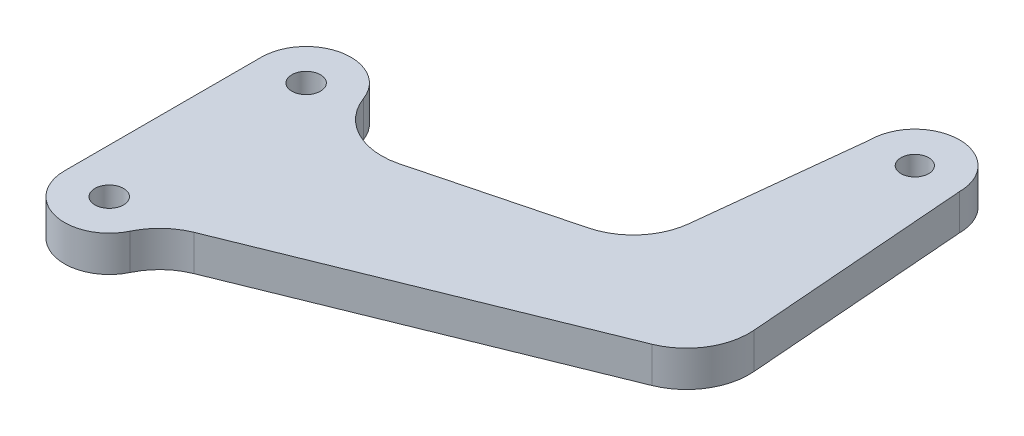
ISO-10303-21;
HEADER;
FILE_DESCRIPTION(('STEP AP214'),'2;1');
FILE_NAME('part.step','',(''),(''),'','','');
FILE_SCHEMA(('AUTOMOTIVE_DESIGN { 1 0 10303 214 1 1 1 1 }'));
ENDSEC;
DATA;
#1=APPLICATION_CONTEXT('core data for automotive mechanical design processes');
#2=APPLICATION_PROTOCOL_DEFINITION('international standard','automotive_design',2000,#1);
#3=PRODUCT_CONTEXT('',#1,'mechanical');
#4=PRODUCT('Part','Part','',(#3));
#5=PRODUCT_RELATED_PRODUCT_CATEGORY('part','',(#4));
#6=PRODUCT_DEFINITION_FORMATION('','',#4);
#7=PRODUCT_DEFINITION_CONTEXT('part definition',#1,'design');
#8=PRODUCT_DEFINITION('design','',#6,#7);
#9=PRODUCT_DEFINITION_SHAPE('','',#8);
#10=(LENGTH_UNIT() NAMED_UNIT(*) SI_UNIT(.MILLI.,.METRE.));
#11=(NAMED_UNIT(*) PLANE_ANGLE_UNIT() SI_UNIT($,.RADIAN.));
#12=(NAMED_UNIT(*) SI_UNIT($,.STERADIAN.) SOLID_ANGLE_UNIT());
#13=UNCERTAINTY_MEASURE_WITH_UNIT(LENGTH_MEASURE(1.E-05),#10,'distance_accuracy_value','');
#14=(GEOMETRIC_REPRESENTATION_CONTEXT(3) GLOBAL_UNCERTAINTY_ASSIGNED_CONTEXT((#13)) GLOBAL_UNIT_ASSIGNED_CONTEXT((#10,
#11,#12)) REPRESENTATION_CONTEXT('',''));
#15=CARTESIAN_POINT('',(0.,0.,0.));
#16=DIRECTION('',(0.,0.,1.));
#17=DIRECTION('',(1.,0.,0.));
#18=AXIS2_PLACEMENT_3D('',#15,#16,#17);
#19=CARTESIAN_POINT('',(0.,-2.,-11.));
#20=DIRECTION('',(0.,1.,0.));
#21=DIRECTION('',(0.,0.,1.));
#22=AXIS2_PLACEMENT_3D('',#19,#20,#21);
#23=CYLINDRICAL_SURFACE('',#22,5.);
#24=CARTESIAN_POINT('',(0.,2.,-11.));
#25=DIRECTION('',(0.,1.,0.));
#26=DIRECTION('',(0.,0.,1.));
#27=AXIS2_PLACEMENT_3D('',#24,#25,#26);
#28=CIRCLE('',#27,5.);
#29=CARTESIAN_POINT('',(4.68975205990545,2.,-12.7338470568688));
#30=VERTEX_POINT('',#29);
#31=CARTESIAN_POINT('',(-5.,2.,-11.));
#32=VERTEX_POINT('',#31);
#33=EDGE_CURVE('E269',#30,#32,#28,.T.);
#34=ORIENTED_EDGE('',*,*,#33,.F.);
#35=DIRECTION('',(0.,1.,0.));
#36=VECTOR('',#35,1.);
#37=CARTESIAN_POINT('',(4.68975205990545,-2.,-12.7338470568688));
#38=LINE('',#37,#36);
#39=CARTESIAN_POINT('',(4.68975205990545,-2.,-12.7338470568688));
#40=VERTEX_POINT('',#39);
#41=EDGE_CURVE('E319',#30,#40,#38,.F.);
#42=ORIENTED_EDGE('',*,*,#41,.T.);
#43=CARTESIAN_POINT('',(0.,-2.,-11.));
#44=DIRECTION('',(0.,1.,0.));
#45=DIRECTION('',(0.,0.,1.));
#46=AXIS2_PLACEMENT_3D('',#43,#44,#45);
#47=CIRCLE('',#46,5.);
#48=CARTESIAN_POINT('',(-5.,-2.,-11.));
#49=VERTEX_POINT('',#48);
#50=EDGE_CURVE('E283',#40,#49,#47,.T.);
#51=ORIENTED_EDGE('',*,*,#50,.T.);
#52=DIRECTION('',(0.,1.,0.));
#53=VECTOR('',#52,1.);
#54=CARTESIAN_POINT('',(-5.,-2.,-11.));
#55=LINE('',#54,#53);
#56=EDGE_CURVE('E294',#49,#32,#55,.T.);
#57=ORIENTED_EDGE('',*,*,#56,.T.);
#58=EDGE_LOOP('',(#34,#42,#51,#57));
#59=FACE_BOUND('',#58,.T.);
#60=ADVANCED_FACE('F133',(#59),#23,.T.);
#61=CARTESIAN_POINT('',(0.,-2.,11.));
#62=DIRECTION('',(0.,1.,0.));
#63=DIRECTION('',(0.,0.,1.));
#64=AXIS2_PLACEMENT_3D('',#61,#62,#63);
#65=CYLINDRICAL_SURFACE('',#64,5.);
#66=CARTESIAN_POINT('',(0.,-2.,11.));
#67=DIRECTION('',(0.,1.,0.));
#68=DIRECTION('',(0.,0.,1.));
#69=AXIS2_PLACEMENT_3D('',#66,#67,#68);
#70=CIRCLE('',#69,5.);
#71=CARTESIAN_POINT('',(-5.,-2.,11.));
#72=VERTEX_POINT('',#71);
#73=CARTESIAN_POINT('',(4.50703845026179,-2.,13.1648566714362));
#74=VERTEX_POINT('',#73);
#75=EDGE_CURVE('E288',#72,#74,#70,.T.);
#76=ORIENTED_EDGE('',*,*,#75,.T.);
#77=DIRECTION('',(0.,1.,0.));
#78=VECTOR('',#77,1.);
#79=CARTESIAN_POINT('',(4.50703845026179,-2.,13.1648566714362));
#80=LINE('',#79,#78);
#81=CARTESIAN_POINT('',(4.50703845026179,2.,13.1648566714362));
#82=VERTEX_POINT('',#81);
#83=EDGE_CURVE('E297',#74,#82,#80,.T.);
#84=ORIENTED_EDGE('',*,*,#83,.T.);
#85=CARTESIAN_POINT('',(0.,2.,11.));
#86=DIRECTION('',(0.,1.,0.));
#87=DIRECTION('',(0.,0.,1.));
#88=AXIS2_PLACEMENT_3D('',#85,#86,#87);
#89=CIRCLE('',#88,5.);
#90=CARTESIAN_POINT('',(-5.,2.,11.));
#91=VERTEX_POINT('',#90);
#92=EDGE_CURVE('E274',#91,#82,#89,.T.);
#93=ORIENTED_EDGE('',*,*,#92,.F.);
#94=DIRECTION('',(0.,1.,0.));
#95=VECTOR('',#94,1.);
#96=CARTESIAN_POINT('',(-5.,-2.,11.));
#97=LINE('',#96,#95);
#98=EDGE_CURVE('E295',#72,#91,#97,.T.);
#99=ORIENTED_EDGE('',*,*,#98,.F.);
#100=EDGE_LOOP('',(#76,#84,#93,#99));
#101=FACE_BOUND('',#100,.T.);
#102=ADVANCED_FACE('F369',(#101),#65,.T.);
#103=CARTESIAN_POINT('',(-5.,-2.,0.));
#104=DIRECTION('',(-1.,0.,0.));
#105=DIRECTION('',(0.,0.,1.));
#106=AXIS2_PLACEMENT_3D('',#103,#104,#105);
#107=PLANE('',#106);
#108=ORIENTED_EDGE('',*,*,#98,.T.);
#109=DIRECTION('',(0.,0.,1.));
#110=VECTOR('',#109,1.);
#111=CARTESIAN_POINT('',(-5.,2.,0.));
#112=LINE('',#111,#110);
#113=EDGE_CURVE('E271',#32,#91,#112,.T.);
#114=ORIENTED_EDGE('',*,*,#113,.F.);
#115=ORIENTED_EDGE('',*,*,#56,.F.);
#116=DIRECTION('',(0.,0.,1.));
#117=VECTOR('',#116,1.);
#118=CARTESIAN_POINT('',(-5.,-2.,0.));
#119=LINE('',#118,#117);
#120=EDGE_CURVE('E285',#49,#72,#119,.T.);
#121=ORIENTED_EDGE('',*,*,#120,.T.);
#122=EDGE_LOOP('',(#108,#114,#115,#121));
#123=FACE_BOUND('',#122,.T.);
#124=ADVANCED_FACE('F374',(#123),#107,.T.);
#125=CARTESIAN_POINT('',(0.,-2.,11.));
#126=DIRECTION('',(0.,1.,0.));
#127=DIRECTION('',(0.,0.,1.));
#128=AXIS2_PLACEMENT_3D('',#125,#126,#127);
#129=CYLINDRICAL_SURFACE('',#128,1.6);
#130=CARTESIAN_POINT('',(0.,-2.,11.));
#131=DIRECTION('',(0.,1.,0.));
#132=DIRECTION('',(0.,0.,1.));
#133=AXIS2_PLACEMENT_3D('',#130,#131,#132);
#134=CIRCLE('',#133,1.6);
#135=CARTESIAN_POINT('',(0.,-2.,12.6));
#136=VERTEX_POINT('',#135);
#137=EDGE_CURVE('E280',#136,#136,#134,.T.);
#138=ORIENTED_EDGE('',*,*,#137,.F.);
#139=EDGE_LOOP('',(#138));
#140=FACE_BOUND('',#139,.T.);
#141=CARTESIAN_POINT('',(0.,2.,11.));
#142=DIRECTION('',(0.,1.,0.));
#143=DIRECTION('',(0.,0.,1.));
#144=AXIS2_PLACEMENT_3D('',#141,#142,#143);
#145=CIRCLE('',#144,1.6);
#146=CARTESIAN_POINT('',(0.,2.,12.6));
#147=VERTEX_POINT('',#146);
#148=EDGE_CURVE('E234',#147,#147,#145,.T.);
#149=ORIENTED_EDGE('',*,*,#148,.T.);
#150=EDGE_LOOP('',(#149));
#151=FACE_BOUND('',#150,.T.);
#152=ADVANCED_FACE('F379',(#140,#151),#129,.F.);
#153=CARTESIAN_POINT('',(0.,-2.,-11.));
#154=DIRECTION('',(0.,1.,0.));
#155=DIRECTION('',(0.,0.,1.));
#156=AXIS2_PLACEMENT_3D('',#153,#154,#155);
#157=CYLINDRICAL_SURFACE('',#156,1.6);
#158=CARTESIAN_POINT('',(0.,-2.,-11.));
#159=DIRECTION('',(0.,1.,0.));
#160=DIRECTION('',(0.,0.,1.));
#161=AXIS2_PLACEMENT_3D('',#158,#159,#160);
#162=CIRCLE('',#161,1.6);
#163=CARTESIAN_POINT('',(0.,-2.,-9.4));
#164=VERTEX_POINT('',#163);
#165=EDGE_CURVE('E291',#164,#164,#162,.T.);
#166=ORIENTED_EDGE('',*,*,#165,.F.);
#167=EDGE_LOOP('',(#166));
#168=FACE_BOUND('',#167,.T.);
#169=CARTESIAN_POINT('',(0.,2.,-11.));
#170=DIRECTION('',(0.,1.,0.));
#171=DIRECTION('',(0.,0.,1.));
#172=AXIS2_PLACEMENT_3D('',#169,#170,#171);
#173=CIRCLE('',#172,1.6);
#174=CARTESIAN_POINT('',(0.,2.,-9.4));
#175=VERTEX_POINT('',#174);
#176=EDGE_CURVE('E277',#175,#175,#173,.T.);
#177=ORIENTED_EDGE('',*,*,#176,.T.);
#178=EDGE_LOOP('',(#177));
#179=FACE_BOUND('',#178,.T.);
#180=ADVANCED_FACE('F382',(#168,#179),#157,.F.);
#181=CARTESIAN_POINT('',(0.,-2.,0.));
#182=DIRECTION('',(0.,1.,0.));
#183=DIRECTION('',(0.,0.,1.));
#184=AXIS2_PLACEMENT_3D('',#181,#182,#183);
#185=PLANE('',#184);
#186=ORIENTED_EDGE('',*,*,#137,.T.);
#187=EDGE_LOOP('',(#186));
#188=FACE_BOUND('',#187,.T.);
#189=DIRECTION('',(0.0774960666400191,0.,0.996992657774031));
#190=VECTOR('',#189,1.);
#191=CARTESIAN_POINT('',(49.5764662533195,-2.,-3.85357013673685));
#192=LINE('',#191,#190);
#193=CARTESIAN_POINT('',(47.,-2.,-37.));
#194=VERTEX_POINT('',#193);
#195=CARTESIAN_POINT('',(48.9375736223951,-2.,-12.0729713238504));
#196=VERTEX_POINT('',#195);
#197=EDGE_CURVE('E231',#194,#196,#192,.T.);
#198=ORIENTED_EDGE('',*,*,#197,.T.);
#199=CARTESIAN_POINT('',(41.9586250179769,-2.,-11.5304988573702));
#200=DIRECTION('',(0.,1.,0.));
#201=DIRECTION('',(0.,0.,1.));
#202=AXIS2_PLACEMENT_3D('',#199,#200,#201);
#203=CIRCLE('',#202,7.);
#204=CARTESIAN_POINT('',(44.5877032677646,-2.,-5.0429764060416));
#205=VERTEX_POINT('',#204);
#206=EDGE_CURVE('E310',#196,#205,#203,.F.);
#207=ORIENTED_EDGE('',*,*,#206,.T.);
#208=DIRECTION('',(-0.926788921618376,0.,0.375582607112532));
#209=VECTOR('',#208,1.);
#210=CARTESIAN_POINT('',(4.5342552674961,-2.,11.1887437547023));
#211=LINE('',#210,#209);
#212=CARTESIAN_POINT('',(8.18781403084058,-2.,9.70813356011821));
#213=VERTEX_POINT('',#212);
#214=EDGE_CURVE('E262',#205,#213,#211,.T.);
#215=ORIENTED_EDGE('',*,*,#214,.T.);
#216=CARTESIAN_POINT('',(10.8168922806283,-2.,16.1956560114468));
#217=DIRECTION('',(0.,1.,0.));
#218=DIRECTION('',(0.,0.,1.));
#219=AXIS2_PLACEMENT_3D('',#216,#217,#218);
#220=CIRCLE('',#219,7.);
#221=EDGE_CURVE('E323',#213,#74,#220,.T.);
#222=ORIENTED_EDGE('',*,*,#221,.T.);
#223=ORIENTED_EDGE('',*,*,#75,.F.);
#224=ORIENTED_EDGE('',*,*,#120,.F.);
#225=ORIENTED_EDGE('',*,*,#50,.F.);
#226=CARTESIAN_POINT('',(11.2554049437731,-2.,-15.1612329364851));
#227=DIRECTION('',(0.,1.,0.));
#228=DIRECTION('',(0.,0.,1.));
#229=AXIS2_PLACEMENT_3D('',#226,#227,#228);
#230=CIRCLE('',#229,7.);
#231=CARTESIAN_POINT('',(13.0139782637248,-2.,-8.38573148800517));
#232=VERTEX_POINT('',#231);
#233=EDGE_CURVE('E12',#40,#232,#230,.T.);
#234=ORIENTED_EDGE('',*,*,#233,.T.);
#235=DIRECTION('',(0.967928778354279,0.,-0.251224759993105));
#236=VECTOR('',#235,1.);
#237=CARTESIAN_POINT('',(-1.2177761664883,-2.,-4.69189659956418));
#238=LINE('',#237,#236);
#239=CARTESIAN_POINT('',(29.79593940318,-2.,-12.7414694862508));
#240=VERTEX_POINT('',#239);
#241=EDGE_CURVE('E254',#232,#240,#238,.T.);
#242=ORIENTED_EDGE('',*,*,#241,.T.);
#243=CARTESIAN_POINT('',(28.0373660832283,-2.,-19.5169709347308));
#244=DIRECTION('',(0.,1.,0.));
#245=DIRECTION('',(0.,0.,1.));
#246=AXIS2_PLACEMENT_3D('',#243,#244,#245);
#247=CIRCLE('',#246,7.);
#248=CARTESIAN_POINT('',(34.9955093042265,-2.,-18.7526130891661));
#249=VERTEX_POINT('',#248);
#250=EDGE_CURVE('E148',#240,#249,#247,.T.);
#251=ORIENTED_EDGE('',*,*,#250,.T.);
#252=DIRECTION('',(-0.109193977937814,0.,0.994020460142605));
#253=VECTOR('',#252,1.);
#254=CARTESIAN_POINT('',(32.54281819854,-2.,3.57485576493656));
#255=LINE('',#254,#253);
#256=CARTESIAN_POINT('',(37.,-2.,-37.));
#257=VERTEX_POINT('',#256);
#258=EDGE_CURVE('E251',#257,#249,#255,.T.);
#259=ORIENTED_EDGE('',*,*,#258,.F.);
#260=CARTESIAN_POINT('',(42.,-2.,-37.));
#261=DIRECTION('',(0.,1.,0.));
#262=DIRECTION('',(0.,0.,1.));
#263=AXIS2_PLACEMENT_3D('',#260,#261,#262);
#264=CIRCLE('',#263,4.99999999999999);
#265=EDGE_CURVE('E350',#194,#257,#264,.T.);
#266=ORIENTED_EDGE('',*,*,#265,.F.);
#267=EDGE_LOOP('',(#198,#207,#215,#222,#223,#224,#225,#234,#242,#251,#259,#266));
#268=FACE_BOUND('',#267,.T.);
#269=ORIENTED_EDGE('',*,*,#165,.T.);
#270=EDGE_LOOP('',(#269));
#271=FACE_BOUND('',#270,.T.);
#272=CARTESIAN_POINT('',(42.,-2.,-37.));
#273=DIRECTION('',(0.,1.,0.));
#274=DIRECTION('',(0.,0.,1.));
#275=AXIS2_PLACEMENT_3D('',#272,#273,#274);
#276=CIRCLE('',#275,1.54999999999999);
#277=CARTESIAN_POINT('',(42.,-2.,-35.45));
#278=VERTEX_POINT('',#277);
#279=EDGE_CURVE('E352',#278,#278,#276,.T.);
#280=ORIENTED_EDGE('',*,*,#279,.T.);
#281=EDGE_LOOP('',(#280));
#282=FACE_BOUND('',#281,.T.);
#283=ADVANCED_FACE('F337',(#188,#268,#271,#282),#185,.F.);
#284=CARTESIAN_POINT('',(0.,2.,0.));
#285=DIRECTION('',(0.,1.,0.));
#286=DIRECTION('',(0.,0.,1.));
#287=AXIS2_PLACEMENT_3D('',#284,#285,#286);
#288=PLANE('',#287);
#289=ORIENTED_EDGE('',*,*,#148,.F.);
#290=EDGE_LOOP('',(#289));
#291=FACE_BOUND('',#290,.T.);
#292=DIRECTION('',(-0.926788921618376,0.,0.375582607112532));
#293=VECTOR('',#292,1.);
#294=CARTESIAN_POINT('',(4.5342552674961,2.,11.1887437547023));
#295=LINE('',#294,#293);
#296=CARTESIAN_POINT('',(44.5877032677646,2.,-5.0429764060416));
#297=VERTEX_POINT('',#296);
#298=CARTESIAN_POINT('',(8.18781403084058,2.,9.70813356011821));
#299=VERTEX_POINT('',#298);
#300=EDGE_CURVE('E252',#297,#299,#295,.T.);
#301=ORIENTED_EDGE('',*,*,#300,.F.);
#302=CARTESIAN_POINT('',(41.9586250179769,2.,-11.5304988573702));
#303=DIRECTION('',(0.,1.,0.));
#304=DIRECTION('',(0.,0.,1.));
#305=AXIS2_PLACEMENT_3D('',#302,#303,#304);
#306=CIRCLE('',#305,7.);
#307=CARTESIAN_POINT('',(48.9375736223951,2.,-12.0729713238504));
#308=VERTEX_POINT('',#307);
#309=EDGE_CURVE('E250',#297,#308,#306,.T.);
#310=ORIENTED_EDGE('',*,*,#309,.T.);
#311=DIRECTION('',(0.0774960666400191,0.,0.996992657774031));
#312=VECTOR('',#311,1.);
#313=CARTESIAN_POINT('',(49.5764662533195,2.,-3.85357013673685));
#314=LINE('',#313,#312);
#315=CARTESIAN_POINT('',(47.,2.,-37.));
#316=VERTEX_POINT('',#315);
#317=EDGE_CURVE('E228',#316,#308,#314,.T.);
#318=ORIENTED_EDGE('',*,*,#317,.F.);
#319=CARTESIAN_POINT('',(42.,2.,-37.));
#320=DIRECTION('',(0.,1.,0.));
#321=DIRECTION('',(0.,0.,1.));
#322=AXIS2_PLACEMENT_3D('',#319,#320,#321);
#323=CIRCLE('',#322,4.99999999999999);
#324=CARTESIAN_POINT('',(37.,2.,-37.));
#325=VERTEX_POINT('',#324);
#326=EDGE_CURVE('E238',#316,#325,#323,.T.);
#327=ORIENTED_EDGE('',*,*,#326,.T.);
#328=DIRECTION('',(-0.109193977937814,0.,0.994020460142605));
#329=VECTOR('',#328,1.);
#330=CARTESIAN_POINT('',(32.54281819854,2.,3.57485576493656));
#331=LINE('',#330,#329);
#332=CARTESIAN_POINT('',(34.9955093042265,2.,-18.7526130891661));
#333=VERTEX_POINT('',#332);
#334=EDGE_CURVE('E244',#325,#333,#331,.T.);
#335=ORIENTED_EDGE('',*,*,#334,.T.);
#336=CARTESIAN_POINT('',(28.0373660832283,2.,-19.5169709347308));
#337=DIRECTION('',(0.,1.,0.));
#338=DIRECTION('',(0.,0.,1.));
#339=AXIS2_PLACEMENT_3D('',#336,#337,#338);
#340=CIRCLE('',#339,7.);
#341=CARTESIAN_POINT('',(29.79593940318,2.,-12.7414694862508));
#342=VERTEX_POINT('',#341);
#343=EDGE_CURVE('E325',#333,#342,#340,.F.);
#344=ORIENTED_EDGE('',*,*,#343,.T.);
#345=DIRECTION('',(0.967928778354279,0.,-0.251224759993105));
#346=VECTOR('',#345,1.);
#347=CARTESIAN_POINT('',(-1.2177761664883,2.,-4.69189659956418));
#348=LINE('',#347,#346);
#349=CARTESIAN_POINT('',(13.0139782637248,2.,-8.38573148800517));
#350=VERTEX_POINT('',#349);
#351=EDGE_CURVE('E257',#350,#342,#348,.T.);
#352=ORIENTED_EDGE('',*,*,#351,.F.);
#353=CARTESIAN_POINT('',(11.2554049437731,2.,-15.1612329364851));
#354=DIRECTION('',(0.,1.,0.));
#355=DIRECTION('',(0.,0.,1.));
#356=AXIS2_PLACEMENT_3D('',#353,#354,#355);
#357=CIRCLE('',#356,7.);
#358=EDGE_CURVE('E141',#350,#30,#357,.F.);
#359=ORIENTED_EDGE('',*,*,#358,.T.);
#360=ORIENTED_EDGE('',*,*,#33,.T.);
#361=ORIENTED_EDGE('',*,*,#113,.T.);
#362=ORIENTED_EDGE('',*,*,#92,.T.);
#363=CARTESIAN_POINT('',(10.8168922806283,2.,16.1956560114468));
#364=DIRECTION('',(0.,1.,0.));
#365=DIRECTION('',(0.,0.,1.));
#366=AXIS2_PLACEMENT_3D('',#363,#364,#365);
#367=CIRCLE('',#366,7.);
#368=EDGE_CURVE('E321',#82,#299,#367,.F.);
#369=ORIENTED_EDGE('',*,*,#368,.T.);
#370=EDGE_LOOP('',(#301,#310,#318,#327,#335,#344,#352,#359,#360,#361,#362,#369));
#371=FACE_BOUND('',#370,.T.);
#372=ORIENTED_EDGE('',*,*,#176,.F.);
#373=EDGE_LOOP('',(#372));
#374=FACE_BOUND('',#373,.T.);
#375=CARTESIAN_POINT('',(42.,2.,-37.));
#376=DIRECTION('',(0.,1.,0.));
#377=DIRECTION('',(0.,0.,1.));
#378=AXIS2_PLACEMENT_3D('',#375,#376,#377);
#379=CIRCLE('',#378,1.54999999999999);
#380=CARTESIAN_POINT('',(42.,2.,-35.45));
#381=VERTEX_POINT('',#380);
#382=EDGE_CURVE('E245',#381,#381,#379,.T.);
#383=ORIENTED_EDGE('',*,*,#382,.F.);
#384=EDGE_LOOP('',(#383));
#385=FACE_BOUND('',#384,.T.);
#386=ADVANCED_FACE('F248',(#291,#371,#374,#385),#288,.T.);
#387=CARTESIAN_POINT('',(42.,2.,-37.));
#388=DIRECTION('',(0.,-1.,0.));
#389=DIRECTION('',(0.,0.,-1.));
#390=AXIS2_PLACEMENT_3D('',#387,#388,#389);
#391=CYLINDRICAL_SURFACE('',#390,4.99999999999999);
#392=ORIENTED_EDGE('',*,*,#326,.F.);
#393=DIRECTION('',(0.,1.,0.));
#394=VECTOR('',#393,1.);
#395=CARTESIAN_POINT('',(47.,-2.,-37.));
#396=LINE('',#395,#394);
#397=EDGE_CURVE('E224',#194,#316,#396,.T.);
#398=ORIENTED_EDGE('',*,*,#397,.F.);
#399=ORIENTED_EDGE('',*,*,#265,.T.);
#400=DIRECTION('',(0.,1.,0.));
#401=VECTOR('',#400,1.);
#402=CARTESIAN_POINT('',(37.,-2.,-37.));
#403=LINE('',#402,#401);
#404=EDGE_CURVE('E235',#257,#325,#403,.T.);
#405=ORIENTED_EDGE('',*,*,#404,.T.);
#406=EDGE_LOOP('',(#392,#398,#399,#405));
#407=FACE_BOUND('',#406,.T.);
#408=ADVANCED_FACE('F239',(#407),#391,.T.);
#409=CARTESIAN_POINT('',(42.,2.,-37.));
#410=DIRECTION('',(0.,-1.,0.));
#411=DIRECTION('',(0.,0.,-1.));
#412=AXIS2_PLACEMENT_3D('',#409,#410,#411);
#413=CYLINDRICAL_SURFACE('',#412,1.54999999999999);
#414=ORIENTED_EDGE('',*,*,#382,.T.);
#415=EDGE_LOOP('',(#414));
#416=FACE_BOUND('',#415,.T.);
#417=ORIENTED_EDGE('',*,*,#279,.F.);
#418=EDGE_LOOP('',(#417));
#419=FACE_BOUND('',#418,.T.);
#420=ADVANCED_FACE('F357',(#416,#419),#413,.F.);
#421=CARTESIAN_POINT('',(49.5764662533195,-2.,-3.85357013673685));
#422=DIRECTION('',(-0.996992657774031,0.,0.0774960666400191));
#423=DIRECTION('',(0.0774960666400191,0.,0.996992657774031));
#424=AXIS2_PLACEMENT_3D('',#421,#422,#423);
#425=PLANE('',#424);
#426=ORIENTED_EDGE('',*,*,#317,.T.);
#427=DIRECTION('',(0.,1.,0.));
#428=VECTOR('',#427,1.);
#429=CARTESIAN_POINT('',(48.9375736223951,-2.,-12.0729713238504));
#430=LINE('',#429,#428);
#431=EDGE_CURVE('E308',#308,#196,#430,.F.);
#432=ORIENTED_EDGE('',*,*,#431,.T.);
#433=ORIENTED_EDGE('',*,*,#197,.F.);
#434=ORIENTED_EDGE('',*,*,#397,.T.);
#435=EDGE_LOOP('',(#426,#432,#433,#434));
#436=FACE_BOUND('',#435,.T.);
#437=ADVANCED_FACE('F226',(#436),#425,.F.);
#438=CARTESIAN_POINT('',(4.5342552674961,-2.,11.1887437547023));
#439=DIRECTION('',(-0.375582607112532,0.,-0.926788921618376));
#440=DIRECTION('',(-0.926788921618376,0.,0.375582607112532));
#441=AXIS2_PLACEMENT_3D('',#438,#439,#440);
#442=PLANE('',#441);
#443=ORIENTED_EDGE('',*,*,#300,.T.);
#444=DIRECTION('',(0.,1.,0.));
#445=VECTOR('',#444,1.);
#446=CARTESIAN_POINT('',(8.18781403084058,-2.,9.70813356011821));
#447=LINE('',#446,#445);
#448=EDGE_CURVE('E305',#299,#213,#447,.F.);
#449=ORIENTED_EDGE('',*,*,#448,.T.);
#450=ORIENTED_EDGE('',*,*,#214,.F.);
#451=DIRECTION('',(0.,1.,0.));
#452=VECTOR('',#451,1.);
#453=CARTESIAN_POINT('',(44.5877032677646,-2.,-5.0429764060416));
#454=LINE('',#453,#452);
#455=EDGE_CURVE('E302',#205,#297,#454,.T.);
#456=ORIENTED_EDGE('',*,*,#455,.T.);
#457=EDGE_LOOP('',(#443,#449,#450,#456));
#458=FACE_BOUND('',#457,.T.);
#459=ADVANCED_FACE('F365',(#458),#442,.F.);
#460=CARTESIAN_POINT('',(-1.2177761664883,-2.,-4.69189659956418));
#461=DIRECTION('',(0.251224759993105,0.,0.967928778354279));
#462=DIRECTION('',(0.967928778354279,0.,-0.251224759993105));
#463=AXIS2_PLACEMENT_3D('',#460,#461,#462);
#464=PLANE('',#463);
#465=ORIENTED_EDGE('',*,*,#351,.T.);
#466=DIRECTION('',(0.,1.,0.));
#467=VECTOR('',#466,1.);
#468=CARTESIAN_POINT('',(29.79593940318,-2.,-12.7414694862508));
#469=LINE('',#468,#467);
#470=EDGE_CURVE('E156',#342,#240,#469,.F.);
#471=ORIENTED_EDGE('',*,*,#470,.T.);
#472=ORIENTED_EDGE('',*,*,#241,.F.);
#473=DIRECTION('',(0.,1.,0.));
#474=VECTOR('',#473,1.);
#475=CARTESIAN_POINT('',(13.0139782637248,-2.,-8.38573148800517));
#476=LINE('',#475,#474);
#477=EDGE_CURVE('E315',#232,#350,#476,.T.);
#478=ORIENTED_EDGE('',*,*,#477,.T.);
#479=EDGE_LOOP('',(#465,#471,#472,#478));
#480=FACE_BOUND('',#479,.T.);
#481=ADVANCED_FACE('F340',(#480),#464,.F.);
#482=CARTESIAN_POINT('',(32.54281819854,-2.,3.57485576493656));
#483=DIRECTION('',(-0.994020460142605,0.,-0.109193977937814));
#484=DIRECTION('',(-0.109193977937814,0.,0.994020460142605));
#485=AXIS2_PLACEMENT_3D('',#482,#483,#484);
#486=PLANE('',#485);
#487=ORIENTED_EDGE('',*,*,#258,.T.);
#488=DIRECTION('',(0.,1.,0.));
#489=VECTOR('',#488,1.);
#490=CARTESIAN_POINT('',(34.9955093042265,-2.,-18.7526130891661));
#491=LINE('',#490,#489);
#492=EDGE_CURVE('E312',#249,#333,#491,.T.);
#493=ORIENTED_EDGE('',*,*,#492,.T.);
#494=ORIENTED_EDGE('',*,*,#334,.F.);
#495=ORIENTED_EDGE('',*,*,#404,.F.);
#496=EDGE_LOOP('',(#487,#493,#494,#495));
#497=FACE_BOUND('',#496,.T.);
#498=ADVANCED_FACE('F345',(#497),#486,.T.);
#499=CARTESIAN_POINT('',(10.8168922806283,-2.,16.1956560114468));
#500=DIRECTION('',(0.,1.,0.));
#501=DIRECTION('',(0.,0.,1.));
#502=AXIS2_PLACEMENT_3D('',#499,#500,#501);
#503=CYLINDRICAL_SURFACE('',#502,7.);
#504=ORIENTED_EDGE('',*,*,#221,.F.);
#505=ORIENTED_EDGE('',*,*,#448,.F.);
#506=ORIENTED_EDGE('',*,*,#368,.F.);
#507=ORIENTED_EDGE('',*,*,#83,.F.);
#508=EDGE_LOOP('',(#504,#505,#506,#507));
#509=FACE_BOUND('',#508,.T.);
#510=ADVANCED_FACE('F384',(#509),#503,.F.);
#511=CARTESIAN_POINT('',(41.9586250179769,-2.,-11.5304988573702));
#512=DIRECTION('',(0.,1.,0.));
#513=DIRECTION('',(0.,0.,1.));
#514=AXIS2_PLACEMENT_3D('',#511,#512,#513);
#515=CYLINDRICAL_SURFACE('',#514,7.);
#516=ORIENTED_EDGE('',*,*,#206,.F.);
#517=ORIENTED_EDGE('',*,*,#431,.F.);
#518=ORIENTED_EDGE('',*,*,#309,.F.);
#519=ORIENTED_EDGE('',*,*,#455,.F.);
#520=EDGE_LOOP('',(#516,#517,#518,#519));
#521=FACE_BOUND('',#520,.T.);
#522=ADVANCED_FACE('F387',(#521),#515,.T.);
#523=CARTESIAN_POINT('',(28.0373660832283,-2.,-19.5169709347308));
#524=DIRECTION('',(0.,1.,0.));
#525=DIRECTION('',(0.,0.,1.));
#526=AXIS2_PLACEMENT_3D('',#523,#524,#525);
#527=CYLINDRICAL_SURFACE('',#526,7.);
#528=ORIENTED_EDGE('',*,*,#250,.F.);
#529=ORIENTED_EDGE('',*,*,#470,.F.);
#530=ORIENTED_EDGE('',*,*,#343,.F.);
#531=ORIENTED_EDGE('',*,*,#492,.F.);
#532=EDGE_LOOP('',(#528,#529,#530,#531));
#533=FACE_BOUND('',#532,.T.);
#534=ADVANCED_FACE('F342',(#533),#527,.F.);
#535=CARTESIAN_POINT('',(11.2554049437731,-2.,-15.1612329364851));
#536=DIRECTION('',(0.,1.,0.));
#537=DIRECTION('',(0.,0.,1.));
#538=AXIS2_PLACEMENT_3D('',#535,#536,#537);
#539=CYLINDRICAL_SURFACE('',#538,7.);
#540=ORIENTED_EDGE('',*,*,#233,.F.);
#541=ORIENTED_EDGE('',*,*,#41,.F.);
#542=ORIENTED_EDGE('',*,*,#358,.F.);
#543=ORIENTED_EDGE('',*,*,#477,.F.);
#544=EDGE_LOOP('',(#540,#541,#542,#543));
#545=FACE_BOUND('',#544,.T.);
#546=ADVANCED_FACE('F135',(#545),#539,.F.);
#547=CLOSED_SHELL('',(#60,#102,#124,#152,#180,#283,#386,#408,#420,#437,#459,#481,#498,#510,#522,
#534,#546));
#548=MANIFOLD_SOLID_BREP('B2',#547);
#549=ADVANCED_BREP_SHAPE_REPRESENTATION('',(#18,#548),#14);
#550=SHAPE_DEFINITION_REPRESENTATION(#9,#549);
ENDSEC;
END-ISO-10303-21;
